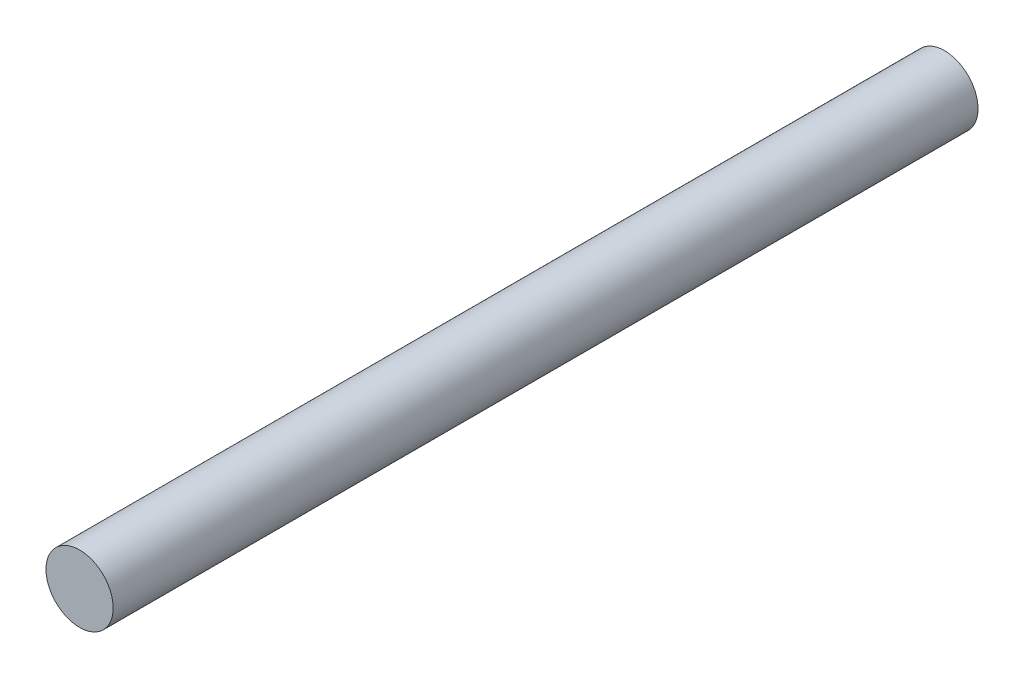
ISO-10303-21;
HEADER;
FILE_DESCRIPTION(('STEP AP214'),'2;1');
FILE_NAME('part.step','',(''),(''),'','','');
FILE_SCHEMA(('AUTOMOTIVE_DESIGN { 1 0 10303 214 1 1 1 1 }'));
ENDSEC;
DATA;
#1=APPLICATION_CONTEXT('core data for automotive mechanical design processes');
#2=APPLICATION_PROTOCOL_DEFINITION('international standard','automotive_design',2000,#1);
#3=PRODUCT_CONTEXT('',#1,'mechanical');
#4=PRODUCT('Part','Part','',(#3));
#5=PRODUCT_RELATED_PRODUCT_CATEGORY('part','',(#4));
#6=PRODUCT_DEFINITION_FORMATION('','',#4);
#7=PRODUCT_DEFINITION_CONTEXT('part definition',#1,'design');
#8=PRODUCT_DEFINITION('design','',#6,#7);
#9=PRODUCT_DEFINITION_SHAPE('','',#8);
#10=(LENGTH_UNIT() NAMED_UNIT(*) SI_UNIT(.MILLI.,.METRE.));
#11=(NAMED_UNIT(*) PLANE_ANGLE_UNIT() SI_UNIT($,.RADIAN.));
#12=(NAMED_UNIT(*) SI_UNIT($,.STERADIAN.) SOLID_ANGLE_UNIT());
#13=UNCERTAINTY_MEASURE_WITH_UNIT(LENGTH_MEASURE(1.E-05),#10,'distance_accuracy_value','');
#14=(GEOMETRIC_REPRESENTATION_CONTEXT(3) GLOBAL_UNCERTAINTY_ASSIGNED_CONTEXT((#13)) GLOBAL_UNIT_ASSIGNED_CONTEXT((#10,
#11,#12)) REPRESENTATION_CONTEXT('',''));
#15=CARTESIAN_POINT('',(0.,0.,0.));
#16=DIRECTION('',(0.,0.,1.));
#17=DIRECTION('',(1.,0.,0.));
#18=AXIS2_PLACEMENT_3D('',#15,#16,#17);
#19=CARTESIAN_POINT('',(0.,0.,20.6));
#20=DIRECTION('',(0.,0.,-1.));
#21=DIRECTION('',(-1.,0.,0.));
#22=AXIS2_PLACEMENT_3D('',#19,#20,#21);
#23=CYLINDRICAL_SURFACE('',#22,0.8);
#24=CARTESIAN_POINT('',(0.,0.,20.6));
#25=DIRECTION('',(0.,0.,1.));
#26=DIRECTION('',(1.,0.,0.));
#27=AXIS2_PLACEMENT_3D('',#24,#25,#26);
#28=CIRCLE('',#27,0.8);
#29=CARTESIAN_POINT('',(-0.8,0.,20.6));
#30=VERTEX_POINT('',#29);
#31=EDGE_CURVE('E10',#30,#30,#28,.T.);
#32=CARTESIAN_POINT('',(0.,0.,0.));
#33=DIRECTION('',(0.,0.,1.));
#34=DIRECTION('',(1.,0.,0.));
#35=AXIS2_PLACEMENT_3D('',#32,#33,#34);
#36=CIRCLE('',#35,0.8);
#37=CARTESIAN_POINT('',(-0.8,0.,0.));
#38=VERTEX_POINT('',#37);
#39=EDGE_CURVE('E38',#38,#38,#36,.T.);
#40=CARTESIAN_POINT('',(-0.8,0.,20.6));
#41=CARTESIAN_POINT('',(-0.8,0.,20.3854166666667));
#42=CARTESIAN_POINT('',(-0.8,0.,20.1708333333333));
#43=CARTESIAN_POINT('',(-0.8,0.,19.7416666666667));
#44=CARTESIAN_POINT('',(-0.8,0.,19.5270833333333));
#45=CARTESIAN_POINT('',(-0.8,0.,19.0979166666667));
#46=CARTESIAN_POINT('',(-0.8,0.,18.8833333333333));
#47=CARTESIAN_POINT('',(-0.8,0.,18.4541666666667));
#48=CARTESIAN_POINT('',(-0.8,0.,18.2395833333333));
#49=CARTESIAN_POINT('',(-0.8,0.,17.8104166666667));
#50=CARTESIAN_POINT('',(-0.8,0.,17.5958333333333));
#51=CARTESIAN_POINT('',(-0.8,0.,17.1666666666667));
#52=CARTESIAN_POINT('',(-0.8,0.,16.9520833333333));
#53=CARTESIAN_POINT('',(-0.8,0.,16.5229166666667));
#54=CARTESIAN_POINT('',(-0.8,0.,16.3083333333333));
#55=CARTESIAN_POINT('',(-0.8,0.,15.8791666666667));
#56=CARTESIAN_POINT('',(-0.8,0.,15.6645833333333));
#57=CARTESIAN_POINT('',(-0.8,0.,15.2354166666667));
#58=CARTESIAN_POINT('',(-0.8,0.,15.0208333333333));
#59=CARTESIAN_POINT('',(-0.8,0.,14.5916666666667));
#60=CARTESIAN_POINT('',(-0.8,0.,14.3770833333333));
#61=CARTESIAN_POINT('',(-0.8,0.,13.9479166666667));
#62=CARTESIAN_POINT('',(-0.8,0.,13.7333333333333));
#63=CARTESIAN_POINT('',(-0.8,0.,13.3041666666667));
#64=CARTESIAN_POINT('',(-0.8,0.,13.0895833333333));
#65=CARTESIAN_POINT('',(-0.8,0.,12.6604166666667));
#66=CARTESIAN_POINT('',(-0.8,0.,12.4458333333333));
#67=CARTESIAN_POINT('',(-0.8,0.,12.0166666666667));
#68=CARTESIAN_POINT('',(-0.8,0.,11.8020833333333));
#69=CARTESIAN_POINT('',(-0.8,0.,11.3729166666667));
#70=CARTESIAN_POINT('',(-0.8,0.,11.1583333333333));
#71=CARTESIAN_POINT('',(-0.8,0.,10.7291666666667));
#72=CARTESIAN_POINT('',(-0.8,0.,10.5145833333333));
#73=CARTESIAN_POINT('',(-0.8,0.,10.0854166666667));
#74=CARTESIAN_POINT('',(-0.8,0.,9.87083333333333));
#75=CARTESIAN_POINT('',(-0.8,0.,9.44166666666666));
#76=CARTESIAN_POINT('',(-0.8,0.,9.22708333333333));
#77=CARTESIAN_POINT('',(-0.8,0.,8.79791666666666));
#78=CARTESIAN_POINT('',(-0.8,0.,8.58333333333333));
#79=CARTESIAN_POINT('',(-0.8,0.,8.15416666666666));
#80=CARTESIAN_POINT('',(-0.8,0.,7.93958333333333));
#81=CARTESIAN_POINT('',(-0.8,0.,7.51041666666666));
#82=CARTESIAN_POINT('',(-0.8,0.,7.29583333333333));
#83=CARTESIAN_POINT('',(-0.8,0.,6.86666666666666));
#84=CARTESIAN_POINT('',(-0.8,0.,6.65208333333333));
#85=CARTESIAN_POINT('',(-0.8,0.,6.22291666666666));
#86=CARTESIAN_POINT('',(-0.8,0.,6.00833333333333));
#87=CARTESIAN_POINT('',(-0.8,0.,5.57916666666666));
#88=CARTESIAN_POINT('',(-0.8,0.,5.36458333333333));
#89=CARTESIAN_POINT('',(-0.8,0.,4.93541666666666));
#90=CARTESIAN_POINT('',(-0.8,0.,4.72083333333333));
#91=CARTESIAN_POINT('',(-0.8,0.,4.29166666666666));
#92=CARTESIAN_POINT('',(-0.8,0.,4.07708333333333));
#93=CARTESIAN_POINT('',(-0.8,0.,3.64791666666666));
#94=CARTESIAN_POINT('',(-0.8,0.,3.43333333333333));
#95=CARTESIAN_POINT('',(-0.8,0.,3.00416666666666));
#96=CARTESIAN_POINT('',(-0.8,0.,2.78958333333333));
#97=CARTESIAN_POINT('',(-0.8,0.,2.36041666666666));
#98=CARTESIAN_POINT('',(-0.8,0.,2.14583333333333));
#99=CARTESIAN_POINT('',(-0.8,0.,1.71666666666666));
#100=CARTESIAN_POINT('',(-0.8,0.,1.50208333333333));
#101=CARTESIAN_POINT('',(-0.8,0.,1.07291666666666));
#102=CARTESIAN_POINT('',(-0.8,0.,0.858333333333329));
#103=CARTESIAN_POINT('',(-0.8,0.,0.429166666666662));
#104=CARTESIAN_POINT('',(-0.8,0.,0.214583333333329));
#105=CARTESIAN_POINT('',(-0.8,0.,0.));
#106=B_SPLINE_CURVE_WITH_KNOTS('',3,(#40,#41,#42,#43,#44,#45,#46,#47,#48,#49,#50,#51,#52,#53,
#54,#55,#56,#57,#58,#59,#60,#61,#62,#63,#64,#65,#66,#67,#68,#69,#70,#71,#72,#73,#74,#75,#76,#77,
#78,#79,#80,#81,#82,#83,#84,#85,#86,#87,#88,#89,#90,#91,#92,#93,#94,#95,#96,#97,#98,#99,#100,
#101,#102,#103,#104,#105),.UNSPECIFIED.,.F.,.F.,(4,2,2,2,2,2,2,2,2,2,2,2,2,2,2,2,2,2,2,2,2,2,2,
2,2,2,2,2,2,2,2,2,4),(0.,0.643749999999998,1.2875,1.93125,2.575,3.21875,3.8625,4.50625,5.15,
5.79375,6.4375,7.08125,7.725,8.36875,9.0125,9.65625,10.3,10.94375,11.5875,12.23125,12.875,
13.51875,14.1625,14.80625,15.45,16.09375,16.7375,17.38125,18.025,18.66875,19.3125,19.95625,
20.6),.UNSPECIFIED.);
#107=EDGE_CURVE('BSEAM35',#30,#38,#106,.T.);
#108=ORIENTED_EDGE('',*,*,#31,.F.);
#109=ORIENTED_EDGE('',*,*,#39,.T.);
#110=ORIENTED_EDGE('',*,*,#107,.T.);
#111=ORIENTED_EDGE('',*,*,#107,.F.);
#112=EDGE_LOOP('',(#108,#110,#109,#111));
#113=FACE_BOUND('',#112,.T.);
#114=ADVANCED_FACE('F35',(#113),#23,.T.);
#115=CARTESIAN_POINT('',(0.,0.,20.6));
#116=DIRECTION('',(0.,0.,1.));
#117=DIRECTION('',(1.,0.,0.));
#118=AXIS2_PLACEMENT_3D('',#115,#116,#117);
#119=PLANE('',#118);
#120=ORIENTED_EDGE('',*,*,#31,.T.);
#121=EDGE_LOOP('',(#120));
#122=FACE_BOUND('',#121,.T.);
#123=ADVANCED_FACE('F50',(#122),#119,.T.);
#124=CARTESIAN_POINT('',(0.,0.,0.));
#125=DIRECTION('',(0.,0.,1.));
#126=DIRECTION('',(1.,0.,0.));
#127=AXIS2_PLACEMENT_3D('',#124,#125,#126);
#128=PLANE('',#127);
#129=ORIENTED_EDGE('',*,*,#39,.F.);
#130=EDGE_LOOP('',(#129));
#131=FACE_BOUND('',#130,.T.);
#132=ADVANCED_FACE('F48',(#131),#128,.F.);
#133=CLOSED_SHELL('',(#114,#123,#132));
#134=MANIFOLD_SOLID_BREP('B2',#133);
#135=ADVANCED_BREP_SHAPE_REPRESENTATION('',(#18,#134),#14);
#136=SHAPE_DEFINITION_REPRESENTATION(#9,#135);
ENDSEC;
END-ISO-10303-21;
